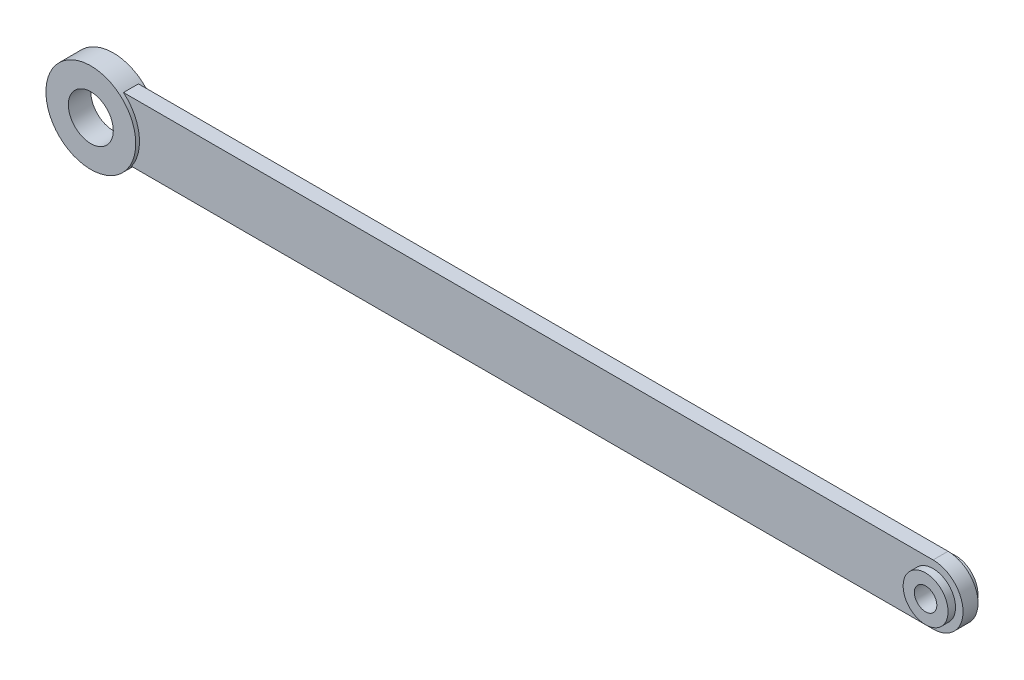
ISO-10303-21;
HEADER;
FILE_DESCRIPTION(('STEP AP214'),'2;1');
FILE_NAME('part.step','',(''),(''),'','','');
FILE_SCHEMA(('AUTOMOTIVE_DESIGN { 1 0 10303 214 1 1 1 1 }'));
ENDSEC;
DATA;
#1=APPLICATION_CONTEXT('core data for automotive mechanical design processes');
#2=APPLICATION_PROTOCOL_DEFINITION('international standard','automotive_design',2000,#1);
#3=PRODUCT_CONTEXT('',#1,'mechanical');
#4=PRODUCT('Part','Part','',(#3));
#5=PRODUCT_RELATED_PRODUCT_CATEGORY('part','',(#4));
#6=PRODUCT_DEFINITION_FORMATION('','',#4);
#7=PRODUCT_DEFINITION_CONTEXT('part definition',#1,'design');
#8=PRODUCT_DEFINITION('design','',#6,#7);
#9=PRODUCT_DEFINITION_SHAPE('','',#8);
#10=(LENGTH_UNIT() NAMED_UNIT(*) SI_UNIT(.MILLI.,.METRE.));
#11=(NAMED_UNIT(*) PLANE_ANGLE_UNIT() SI_UNIT($,.RADIAN.));
#12=(NAMED_UNIT(*) SI_UNIT($,.STERADIAN.) SOLID_ANGLE_UNIT());
#13=UNCERTAINTY_MEASURE_WITH_UNIT(LENGTH_MEASURE(1.E-05),#10,'distance_accuracy_value','');
#14=(GEOMETRIC_REPRESENTATION_CONTEXT(3) GLOBAL_UNCERTAINTY_ASSIGNED_CONTEXT((#13)) GLOBAL_UNIT_ASSIGNED_CONTEXT((#10,
#11,#12)) REPRESENTATION_CONTEXT('',''));
#15=CARTESIAN_POINT('',(0.,0.,0.));
#16=DIRECTION('',(0.,0.,1.));
#17=DIRECTION('',(1.,0.,0.));
#18=AXIS2_PLACEMENT_3D('',#15,#16,#17);
#19=CARTESIAN_POINT('',(53443.6657096856,524.491834732401,1501.5));
#20=DIRECTION('',(0.,0.,-1.));
#21=DIRECTION('',(-1.,0.,0.));
#22=AXIS2_PLACEMENT_3D('',#19,#20,#21);
#23=CYLINDRICAL_SURFACE('',#22,6.);
#24=CARTESIAN_POINT('',(53443.6657096856,524.491834732401,1498.5));
#25=DIRECTION('',(0.,0.,1.));
#26=DIRECTION('',(1.,0.,0.));
#27=AXIS2_PLACEMENT_3D('',#24,#25,#26);
#28=CIRCLE('',#27,6.);
#29=CARTESIAN_POINT('',(53449.6657096856,524.491834732401,1498.5));
#30=VERTEX_POINT('',#29);
#31=EDGE_CURVE('E113',#30,#30,#28,.T.);
#32=ORIENTED_EDGE('',*,*,#31,.T.);
#33=EDGE_LOOP('',(#32));
#34=FACE_BOUND('',#33,.T.);
#35=CARTESIAN_POINT('',(53443.6657096856,524.491834732401,1501.5));
#36=DIRECTION('',(0.,0.,1.));
#37=DIRECTION('',(1.,0.,0.));
#38=AXIS2_PLACEMENT_3D('',#35,#36,#37);
#39=CIRCLE('',#38,6.);
#40=CARTESIAN_POINT('',(53449.6657096856,524.491834732401,1501.5));
#41=VERTEX_POINT('',#40);
#42=EDGE_CURVE('E116',#41,#41,#39,.T.);
#43=ORIENTED_EDGE('',*,*,#42,.F.);
#44=EDGE_LOOP('',(#43));
#45=FACE_BOUND('',#44,.T.);
#46=CARTESIAN_POINT('',(53443.6657096856,524.491834732401,1499.));
#47=DIRECTION('',(0.,0.,1.));
#48=DIRECTION('',(1.,0.,0.));
#49=AXIS2_PLACEMENT_3D('',#46,#47,#48);
#50=CIRCLE('',#49,6.);
#51=CARTESIAN_POINT('',(53448.6054726461,521.086142160484,1499.));
#52=VERTEX_POINT('',#51);
#53=CARTESIAN_POINT('',(53447.5247690602,529.086142160484,1499.));
#54=VERTEX_POINT('',#53);
#55=EDGE_CURVE('E47',#52,#54,#50,.T.);
#56=ORIENTED_EDGE('',*,*,#55,.F.);
#57=DIRECTION('',(0.,0.,-1.));
#58=VECTOR('',#57,1.);
#59=CARTESIAN_POINT('',(53448.6054726461,521.086142160484,1501.5));
#60=LINE('',#59,#58);
#61=CARTESIAN_POINT('',(53448.6054726461,521.086142160484,1501.));
#62=VERTEX_POINT('',#61);
#63=EDGE_CURVE('E62',#52,#62,#60,.F.);
#64=ORIENTED_EDGE('',*,*,#63,.T.);
#65=CARTESIAN_POINT('',(53443.6657096856,524.491834732401,1501.));
#66=DIRECTION('',(0.,0.,1.));
#67=DIRECTION('',(1.,0.,0.));
#68=AXIS2_PLACEMENT_3D('',#65,#66,#67);
#69=CIRCLE('',#68,6.);
#70=CARTESIAN_POINT('',(53447.5247690602,529.086142160484,1501.));
#71=VERTEX_POINT('',#70);
#72=EDGE_CURVE('E85',#62,#71,#69,.T.);
#73=ORIENTED_EDGE('',*,*,#72,.T.);
#74=DIRECTION('',(0.,0.,-1.));
#75=VECTOR('',#74,1.);
#76=CARTESIAN_POINT('',(53447.5247690602,529.086142160484,1501.5));
#77=LINE('',#76,#75);
#78=EDGE_CURVE('E123',#71,#54,#77,.T.);
#79=ORIENTED_EDGE('',*,*,#78,.T.);
#80=EDGE_LOOP('',(#56,#64,#73,#79));
#81=FACE_BOUND('',#80,.T.);
#82=ADVANCED_FACE('F40',(#34,#45,#81),#23,.T.);
#83=CARTESIAN_POINT('',(53443.6657096856,524.491834732401,1501.5));
#84=DIRECTION('',(0.,0.,1.));
#85=DIRECTION('',(1.,0.,0.));
#86=AXIS2_PLACEMENT_3D('',#83,#84,#85);
#87=PLANE('',#86);
#88=ORIENTED_EDGE('',*,*,#42,.T.);
#89=EDGE_LOOP('',(#88));
#90=FACE_BOUND('',#89,.T.);
#91=CARTESIAN_POINT('',(53443.6657096856,524.491834732401,1501.5));
#92=DIRECTION('',(0.,0.,1.));
#93=DIRECTION('',(1.,0.,0.));
#94=AXIS2_PLACEMENT_3D('',#91,#92,#93);
#95=CIRCLE('',#94,3.);
#96=CARTESIAN_POINT('',(53446.6657096856,524.491834732401,1501.5));
#97=VERTEX_POINT('',#96);
#98=EDGE_CURVE('E110',#97,#97,#95,.T.);
#99=ORIENTED_EDGE('',*,*,#98,.F.);
#100=EDGE_LOOP('',(#99));
#101=FACE_BOUND('',#100,.T.);
#102=ADVANCED_FACE('F133',(#90,#101),#87,.T.);
#103=CARTESIAN_POINT('',(53443.6657096856,524.491834732401,1498.5));
#104=DIRECTION('',(0.,0.,1.));
#105=DIRECTION('',(1.,0.,0.));
#106=AXIS2_PLACEMENT_3D('',#103,#104,#105);
#107=PLANE('',#106);
#108=ORIENTED_EDGE('',*,*,#31,.F.);
#109=EDGE_LOOP('',(#108));
#110=FACE_BOUND('',#109,.T.);
#111=CARTESIAN_POINT('',(53443.6657096856,524.491834732401,1498.5));
#112=DIRECTION('',(0.,0.,1.));
#113=DIRECTION('',(1.,0.,0.));
#114=AXIS2_PLACEMENT_3D('',#111,#112,#113);
#115=CIRCLE('',#114,3.);
#116=CARTESIAN_POINT('',(53446.6657096856,524.491834732401,1498.5));
#117=VERTEX_POINT('',#116);
#118=EDGE_CURVE('E108',#117,#117,#115,.T.);
#119=ORIENTED_EDGE('',*,*,#118,.T.);
#120=EDGE_LOOP('',(#119));
#121=FACE_BOUND('',#120,.T.);
#122=ADVANCED_FACE('F138',(#110,#121),#107,.F.);
#123=CARTESIAN_POINT('',(53443.6657096856,524.491834732401,1501.5));
#124=DIRECTION('',(0.,0.,-1.));
#125=DIRECTION('',(-1.,0.,0.));
#126=AXIS2_PLACEMENT_3D('',#123,#124,#125);
#127=CYLINDRICAL_SURFACE('',#126,3.);
#128=ORIENTED_EDGE('',*,*,#98,.T.);
#129=EDGE_LOOP('',(#128));
#130=FACE_BOUND('',#129,.T.);
#131=ORIENTED_EDGE('',*,*,#118,.F.);
#132=EDGE_LOOP('',(#131));
#133=FACE_BOUND('',#132,.T.);
#134=ADVANCED_FACE('F147',(#130,#133),#127,.F.);
#135=CARTESIAN_POINT('',(53444.806124642,529.086142160484,1499.));
#136=DIRECTION('',(0.,1.,0.));
#137=DIRECTION('',(0.,0.,1.));
#138=AXIS2_PLACEMENT_3D('',#135,#136,#137);
#139=PLANE('',#138);
#140=ORIENTED_EDGE('',*,*,#78,.F.);
#141=DIRECTION('',(-1.,0.,0.));
#142=VECTOR('',#141,1.);
#143=CARTESIAN_POINT('',(53444.806124642,529.086142160484,1501.));
#144=LINE('',#143,#142);
#145=CARTESIAN_POINT('',(53555.6657096856,529.086142160484,1501.));
#146=VERTEX_POINT('',#145);
#147=EDGE_CURVE('E54',#146,#71,#144,.T.);
#148=ORIENTED_EDGE('',*,*,#147,.F.);
#149=DIRECTION('',(0.,0.,1.));
#150=VECTOR('',#149,1.);
#151=CARTESIAN_POINT('',(53555.6657096856,529.086142160484,1499.));
#152=LINE('',#151,#150);
#153=CARTESIAN_POINT('',(53555.6657096856,529.086142160484,1499.));
#154=VERTEX_POINT('',#153);
#155=EDGE_CURVE('E95',#154,#146,#152,.T.);
#156=ORIENTED_EDGE('',*,*,#155,.F.);
#157=DIRECTION('',(-1.,0.,0.));
#158=VECTOR('',#157,1.);
#159=CARTESIAN_POINT('',(53444.806124642,529.086142160484,1499.));
#160=LINE('',#159,#158);
#161=EDGE_CURVE('E96',#154,#54,#160,.T.);
#162=ORIENTED_EDGE('',*,*,#161,.T.);
#163=EDGE_LOOP('',(#140,#148,#156,#162));
#164=FACE_BOUND('',#163,.T.);
#165=ADVANCED_FACE('F131',(#164),#139,.T.);
#166=CARTESIAN_POINT('',(53446.9534847877,521.086142160484,1499.));
#167=DIRECTION('',(0.,-1.,0.));
#168=DIRECTION('',(0.,0.,-1.));
#169=AXIS2_PLACEMENT_3D('',#166,#167,#168);
#170=PLANE('',#169);
#171=ORIENTED_EDGE('',*,*,#63,.F.);
#172=DIRECTION('',(1.,0.,0.));
#173=VECTOR('',#172,1.);
#174=CARTESIAN_POINT('',(53446.9534847877,521.086142160484,1499.));
#175=LINE('',#174,#173);
#176=CARTESIAN_POINT('',(53555.6657096856,521.086142160484,1499.));
#177=VERTEX_POINT('',#176);
#178=EDGE_CURVE('E91',#52,#177,#175,.T.);
#179=ORIENTED_EDGE('',*,*,#178,.T.);
#180=DIRECTION('',(0.,0.,1.));
#181=VECTOR('',#180,1.);
#182=CARTESIAN_POINT('',(53555.6657096856,521.086142160484,1499.));
#183=LINE('',#182,#181);
#184=CARTESIAN_POINT('',(53555.6657096856,521.086142160484,1501.));
#185=VERTEX_POINT('',#184);
#186=EDGE_CURVE('E89',#177,#185,#183,.T.);
#187=ORIENTED_EDGE('',*,*,#186,.T.);
#188=DIRECTION('',(1.,0.,0.));
#189=VECTOR('',#188,1.);
#190=CARTESIAN_POINT('',(53446.9534847877,521.086142160484,1501.));
#191=LINE('',#190,#189);
#192=EDGE_CURVE('E79',#62,#185,#191,.T.);
#193=ORIENTED_EDGE('',*,*,#192,.F.);
#194=EDGE_LOOP('',(#171,#179,#187,#193));
#195=FACE_BOUND('',#194,.T.);
#196=ADVANCED_FACE('F90',(#195),#170,.T.);
#197=CARTESIAN_POINT('',(53555.6657096856,525.086142160484,1499.));
#198=DIRECTION('',(0.,0.,1.));
#199=DIRECTION('',(1.,0.,0.));
#200=AXIS2_PLACEMENT_3D('',#197,#198,#199);
#201=CYLINDRICAL_SURFACE('',#200,4.);
#202=ORIENTED_EDGE('',*,*,#155,.T.);
#203=CARTESIAN_POINT('',(53555.6657096856,525.086142160484,1501.));
#204=DIRECTION('',(0.,0.,1.));
#205=DIRECTION('',(1.,0.,0.));
#206=AXIS2_PLACEMENT_3D('',#203,#204,#205);
#207=CIRCLE('',#206,4.);
#208=EDGE_CURVE('E83',#185,#146,#207,.T.);
#209=ORIENTED_EDGE('',*,*,#208,.F.);
#210=ORIENTED_EDGE('',*,*,#186,.F.);
#211=CARTESIAN_POINT('',(53555.6657096856,525.086142160484,1499.));
#212=DIRECTION('',(0.,0.,1.));
#213=DIRECTION('',(1.,0.,0.));
#214=AXIS2_PLACEMENT_3D('',#211,#212,#213);
#215=CIRCLE('',#214,4.);
#216=EDGE_CURVE('E104',#177,#154,#215,.T.);
#217=ORIENTED_EDGE('',*,*,#216,.T.);
#218=EDGE_LOOP('',(#202,#209,#210,#217));
#219=FACE_BOUND('',#218,.T.);
#220=ADVANCED_FACE('F98',(#219),#201,.T.);
#221=CARTESIAN_POINT('',(53443.6657096856,524.491834732401,1499.));
#222=DIRECTION('',(0.,0.,1.));
#223=DIRECTION('',(1.,0.,0.));
#224=AXIS2_PLACEMENT_3D('',#221,#222,#223);
#225=PLANE('',#224);
#226=CARTESIAN_POINT('',(53555.6657096856,525.086142160484,1499.));
#227=DIRECTION('',(0.,0.,1.));
#228=DIRECTION('',(1.,0.,0.));
#229=AXIS2_PLACEMENT_3D('',#226,#227,#228);
#230=CIRCLE('',#229,3.);
#231=CARTESIAN_POINT('',(53558.6657096856,525.086142160484,1499.));
#232=VERTEX_POINT('',#231);
#233=EDGE_CURVE('E86',#232,#232,#230,.T.);
#234=ORIENTED_EDGE('',*,*,#233,.T.);
#235=EDGE_LOOP('',(#234));
#236=FACE_BOUND('',#235,.T.);
#237=ORIENTED_EDGE('',*,*,#178,.F.);
#238=ORIENTED_EDGE('',*,*,#55,.T.);
#239=ORIENTED_EDGE('',*,*,#161,.F.);
#240=ORIENTED_EDGE('',*,*,#216,.F.);
#241=EDGE_LOOP('',(#237,#238,#239,#240));
#242=FACE_BOUND('',#241,.T.);
#243=ADVANCED_FACE('F128',(#236,#242),#225,.F.);
#244=CARTESIAN_POINT('',(53443.6657096856,524.491834732401,1501.));
#245=DIRECTION('',(0.,0.,1.));
#246=DIRECTION('',(1.,0.,0.));
#247=AXIS2_PLACEMENT_3D('',#244,#245,#246);
#248=PLANE('',#247);
#249=CARTESIAN_POINT('',(53555.6657096856,525.086142160484,1501.));
#250=DIRECTION('',(0.,0.,1.));
#251=DIRECTION('',(1.,0.,0.));
#252=AXIS2_PLACEMENT_3D('',#249,#250,#251);
#253=CIRCLE('',#252,3.);
#254=CARTESIAN_POINT('',(53558.6657096856,525.086142160484,1501.));
#255=VERTEX_POINT('',#254);
#256=EDGE_CURVE('E11',#255,#255,#253,.T.);
#257=ORIENTED_EDGE('',*,*,#256,.F.);
#258=EDGE_LOOP('',(#257));
#259=FACE_BOUND('',#258,.T.);
#260=ORIENTED_EDGE('',*,*,#72,.F.);
#261=ORIENTED_EDGE('',*,*,#192,.T.);
#262=ORIENTED_EDGE('',*,*,#208,.T.);
#263=ORIENTED_EDGE('',*,*,#147,.T.);
#264=EDGE_LOOP('',(#260,#261,#262,#263));
#265=FACE_BOUND('',#264,.T.);
#266=ADVANCED_FACE('F81',(#259,#265),#248,.T.);
#267=CARTESIAN_POINT('',(53555.6657096856,525.086142160484,1502.));
#268=DIRECTION('',(0.,0.,-1.));
#269=DIRECTION('',(-1.,0.,0.));
#270=AXIS2_PLACEMENT_3D('',#267,#268,#269);
#271=PLANE('',#270);
#272=CARTESIAN_POINT('',(53555.6657096856,525.086142160484,1502.));
#273=DIRECTION('',(0.,0.,-1.));
#274=DIRECTION('',(-1.,0.,0.));
#275=AXIS2_PLACEMENT_3D('',#272,#273,#274);
#276=CIRCLE('',#275,1.5);
#277=CARTESIAN_POINT('',(53554.1657096856,525.086142160484,1502.));
#278=VERTEX_POINT('',#277);
#279=EDGE_CURVE('E194',#278,#278,#276,.T.);
#280=ORIENTED_EDGE('',*,*,#279,.T.);
#281=EDGE_LOOP('',(#280));
#282=FACE_BOUND('',#281,.T.);
#283=CARTESIAN_POINT('',(53555.6657096856,525.086142160484,1502.));
#284=DIRECTION('',(0.,0.,-1.));
#285=DIRECTION('',(-1.,0.,0.));
#286=AXIS2_PLACEMENT_3D('',#283,#284,#285);
#287=CIRCLE('',#286,3.);
#288=CARTESIAN_POINT('',(53552.6657096856,525.086142160484,1502.));
#289=VERTEX_POINT('',#288);
#290=EDGE_CURVE('E198',#289,#289,#287,.T.);
#291=ORIENTED_EDGE('',*,*,#290,.F.);
#292=EDGE_LOOP('',(#291));
#293=FACE_BOUND('',#292,.T.);
#294=ADVANCED_FACE('F169',(#282,#293),#271,.F.);
#295=CARTESIAN_POINT('',(53555.6657096856,525.086142160484,1502.));
#296=DIRECTION('',(0.,0.,-1.));
#297=DIRECTION('',(-1.,0.,0.));
#298=AXIS2_PLACEMENT_3D('',#295,#296,#297);
#299=CYLINDRICAL_SURFACE('',#298,3.);
#300=ORIENTED_EDGE('',*,*,#256,.T.);
#301=EDGE_LOOP('',(#300));
#302=FACE_BOUND('',#301,.T.);
#303=ORIENTED_EDGE('',*,*,#290,.T.);
#304=EDGE_LOOP('',(#303));
#305=FACE_BOUND('',#304,.T.);
#306=ADVANCED_FACE('F171',(#302,#305),#299,.T.);
#307=CARTESIAN_POINT('',(53555.6657096856,525.086142160484,1498.));
#308=DIRECTION('',(0.,0.,-1.));
#309=DIRECTION('',(-1.,0.,0.));
#310=AXIS2_PLACEMENT_3D('',#307,#308,#309);
#311=CIRCLE('',#310,3.);
#312=CARTESIAN_POINT('',(53552.6657096856,525.086142160484,1498.));
#313=VERTEX_POINT('',#312);
#314=EDGE_CURVE('E195',#313,#313,#311,.T.);
#315=ORIENTED_EDGE('',*,*,#314,.F.);
#316=EDGE_LOOP('',(#315));
#317=FACE_BOUND('',#316,.T.);
#318=ORIENTED_EDGE('',*,*,#233,.F.);
#319=EDGE_LOOP('',(#318));
#320=FACE_BOUND('',#319,.T.);
#321=ADVANCED_FACE('F174',(#317,#320),#299,.T.);
#322=CARTESIAN_POINT('',(53555.6657096856,525.086142160484,1498.));
#323=DIRECTION('',(0.,0.,-1.));
#324=DIRECTION('',(-1.,0.,0.));
#325=AXIS2_PLACEMENT_3D('',#322,#323,#324);
#326=PLANE('',#325);
#327=CARTESIAN_POINT('',(53555.6657096856,525.086142160484,1498.));
#328=DIRECTION('',(0.,0.,-1.));
#329=DIRECTION('',(-1.,0.,0.));
#330=AXIS2_PLACEMENT_3D('',#327,#328,#329);
#331=CIRCLE('',#330,1.5);
#332=CARTESIAN_POINT('',(53554.1657096856,525.086142160484,1498.));
#333=VERTEX_POINT('',#332);
#334=EDGE_CURVE('E191',#333,#333,#331,.T.);
#335=ORIENTED_EDGE('',*,*,#334,.F.);
#336=EDGE_LOOP('',(#335));
#337=FACE_BOUND('',#336,.T.);
#338=ORIENTED_EDGE('',*,*,#314,.T.);
#339=EDGE_LOOP('',(#338));
#340=FACE_BOUND('',#339,.T.);
#341=ADVANCED_FACE('F179',(#337,#340),#326,.T.);
#342=CARTESIAN_POINT('',(53555.6657096856,525.086142160484,1503.));
#343=DIRECTION('',(0.,0.,-1.));
#344=DIRECTION('',(-1.,0.,0.));
#345=AXIS2_PLACEMENT_3D('',#342,#343,#344);
#346=CYLINDRICAL_SURFACE('',#345,1.5);
#347=ORIENTED_EDGE('',*,*,#334,.T.);
#348=EDGE_LOOP('',(#347));
#349=FACE_BOUND('',#348,.T.);
#350=ORIENTED_EDGE('',*,*,#279,.F.);
#351=EDGE_LOOP('',(#350));
#352=FACE_BOUND('',#351,.T.);
#353=ADVANCED_FACE('F182',(#349,#352),#346,.F.);
#354=CLOSED_SHELL('',(#82,#102,#122,#134,#165,#196,#220,#243,#266,#294,#306,#321,#341,#353));
#355=MANIFOLD_SOLID_BREP('B2',#354);
#356=ADVANCED_BREP_SHAPE_REPRESENTATION('',(#18,#355),#14);
#357=SHAPE_DEFINITION_REPRESENTATION(#9,#356);
ENDSEC;
END-ISO-10303-21;
